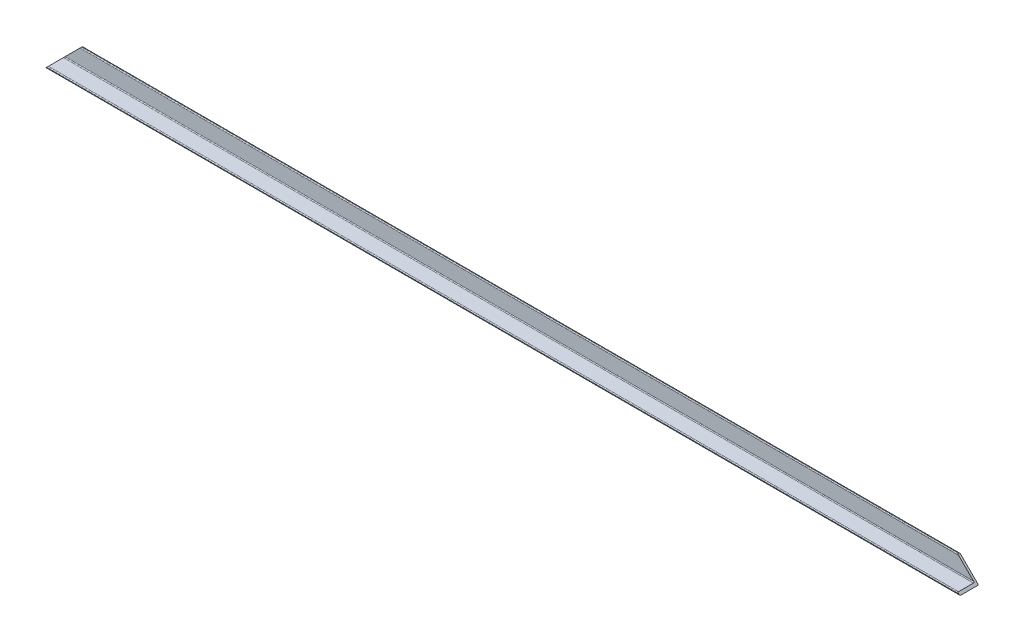
ISO-10303-21;
HEADER;
FILE_DESCRIPTION(('STEP AP214'),'2;1');
FILE_NAME('part.step','',(''),(''),'','','');
FILE_SCHEMA(('AUTOMOTIVE_DESIGN { 1 0 10303 214 1 1 1 1 }'));
ENDSEC;
DATA;
#1=APPLICATION_CONTEXT('core data for automotive mechanical design processes');
#2=APPLICATION_PROTOCOL_DEFINITION('international standard','automotive_design',2000,#1);
#3=PRODUCT_CONTEXT('',#1,'mechanical');
#4=PRODUCT('Part','Part','',(#3));
#5=PRODUCT_RELATED_PRODUCT_CATEGORY('part','',(#4));
#6=PRODUCT_DEFINITION_FORMATION('','',#4);
#7=PRODUCT_DEFINITION_CONTEXT('part definition',#1,'design');
#8=PRODUCT_DEFINITION('design','',#6,#7);
#9=PRODUCT_DEFINITION_SHAPE('','',#8);
#10=(LENGTH_UNIT() NAMED_UNIT(*) SI_UNIT(.MILLI.,.METRE.));
#11=(NAMED_UNIT(*) PLANE_ANGLE_UNIT() SI_UNIT($,.RADIAN.));
#12=(NAMED_UNIT(*) SI_UNIT($,.STERADIAN.) SOLID_ANGLE_UNIT());
#13=UNCERTAINTY_MEASURE_WITH_UNIT(LENGTH_MEASURE(1.E-05),#10,'distance_accuracy_value','');
#14=(GEOMETRIC_REPRESENTATION_CONTEXT(3) GLOBAL_UNCERTAINTY_ASSIGNED_CONTEXT((#13)) GLOBAL_UNIT_ASSIGNED_CONTEXT((#10,
#11,#12)) REPRESENTATION_CONTEXT('',''));
#15=CARTESIAN_POINT('',(0.,0.,0.));
#16=DIRECTION('',(0.,0.,1.));
#17=DIRECTION('',(1.,0.,0.));
#18=AXIS2_PLACEMENT_3D('',#15,#16,#17);
#19=CARTESIAN_POINT('',(-557.5,2.5,-11.25));
#20=DIRECTION('',(0.,0.,1.));
#21=DIRECTION('',(1.,0.,0.));
#22=AXIS2_PLACEMENT_3D('',#19,#20,#21);
#23=PLANE('',#22);
#24=DIRECTION('',(-0.707106781186543,0.707106781186553,0.));
#25=VECTOR('',#24,1.);
#26=CARTESIAN_POINT('',(-4.99999999999212,555.,-11.25));
#27=LINE('',#26,#25);
#28=CARTESIAN_POINT('',(549.,0.99999999999989,-11.25));
#29=VERTEX_POINT('',#28);
#30=CARTESIAN_POINT('',(528.500000000001,21.5,-11.25));
#31=VERTEX_POINT('',#30);
#32=EDGE_CURVE('E125',#29,#31,#27,.T.);
#33=ORIENTED_EDGE('',*,*,#32,.F.);
#34=DIRECTION('',(-1.,0.,0.));
#35=VECTOR('',#34,1.);
#36=CARTESIAN_POINT('',(-557.5,1.,-11.25));
#37=LINE('',#36,#35);
#38=CARTESIAN_POINT('',(-549.,1.00000000000002,-11.25));
#39=VERTEX_POINT('',#38);
#40=EDGE_CURVE('E137',#29,#39,#37,.T.);
#41=ORIENTED_EDGE('',*,*,#40,.T.);
#42=DIRECTION('',(-0.707106781186544,-0.707106781186551,0.));
#43=VECTOR('',#42,1.);
#44=CARTESIAN_POINT('',(-552.5,-2.49999999999995,-11.25));
#45=LINE('',#44,#43);
#46=CARTESIAN_POINT('',(-528.5,21.5,-11.25));
#47=VERTEX_POINT('',#46);
#48=EDGE_CURVE('E220',#47,#39,#45,.T.);
#49=ORIENTED_EDGE('',*,*,#48,.F.);
#50=DIRECTION('',(-1.,0.,0.));
#51=VECTOR('',#50,1.);
#52=CARTESIAN_POINT('',(527.5,21.5,-11.25));
#53=LINE('',#52,#51);
#54=EDGE_CURVE('E140',#47,#31,#53,.F.);
#55=ORIENTED_EDGE('',*,*,#54,.T.);
#56=EDGE_LOOP('',(#33,#41,#49,#55));
#57=FACE_BOUND('',#56,.T.);
#58=ADVANCED_FACE('F32',(#57),#23,.F.);
#59=CARTESIAN_POINT('',(-557.5,2.5,11.25));
#60=DIRECTION('',(0.,0.,-1.));
#61=DIRECTION('',(-1.,0.,0.));
#62=AXIS2_PLACEMENT_3D('',#59,#60,#61);
#63=PLANE('',#62);
#64=DIRECTION('',(0.707106781186544,0.707106781186551,0.));
#65=VECTOR('',#64,1.);
#66=CARTESIAN_POINT('',(-557.5,-7.5,11.25));
#67=LINE('',#66,#65);
#68=CARTESIAN_POINT('',(-549.,1.00000000000002,11.25));
#69=VERTEX_POINT('',#68);
#70=CARTESIAN_POINT('',(-548.5,1.49999999999999,11.25));
#71=VERTEX_POINT('',#70);
#72=EDGE_CURVE('E141',#69,#71,#67,.T.);
#73=ORIENTED_EDGE('',*,*,#72,.F.);
#74=DIRECTION('',(1.,0.,0.));
#75=VECTOR('',#74,1.);
#76=CARTESIAN_POINT('',(-557.5,1.,11.25));
#77=LINE('',#76,#75);
#78=CARTESIAN_POINT('',(549.,0.999999999999977,11.25));
#79=VERTEX_POINT('',#78);
#80=EDGE_CURVE('E170',#69,#79,#77,.T.);
#81=ORIENTED_EDGE('',*,*,#80,.T.);
#82=DIRECTION('',(0.707106781186542,-0.707106781186552,0.));
#83=VECTOR('',#82,1.);
#84=CARTESIAN_POINT('',(557.5,-7.5,11.25));
#85=LINE('',#84,#83);
#86=CARTESIAN_POINT('',(548.5,1.50000000000001,11.25));
#87=VERTEX_POINT('',#86);
#88=EDGE_CURVE('E233',#87,#79,#85,.T.);
#89=ORIENTED_EDGE('',*,*,#88,.F.);
#90=DIRECTION('',(1.,0.,0.));
#91=VECTOR('',#90,1.);
#92=CARTESIAN_POINT('',(-547.5,1.5,11.25));
#93=LINE('',#92,#91);
#94=EDGE_CURVE('E132',#87,#71,#93,.F.);
#95=ORIENTED_EDGE('',*,*,#94,.T.);
#96=EDGE_LOOP('',(#73,#81,#89,#95));
#97=FACE_BOUND('',#96,.T.);
#98=ADVANCED_FACE('F240',(#97),#63,.F.);
#99=CARTESIAN_POINT('',(0.,2.5,0.));
#100=DIRECTION('',(0.,1.,0.));
#101=DIRECTION('',(0.,0.,1.));
#102=AXIS2_PLACEMENT_3D('',#99,#100,#101);
#103=PLANE('',#102);
#104=DIRECTION('',(0.,0.,1.));
#105=VECTOR('',#104,1.);
#106=CARTESIAN_POINT('',(-547.5,2.5,0.));
#107=LINE('',#106,#105);
#108=CARTESIAN_POINT('',(-547.5,2.5,-7.75));
#109=VERTEX_POINT('',#108);
#110=CARTESIAN_POINT('',(-547.5,2.5,10.25));
#111=VERTEX_POINT('',#110);
#112=EDGE_CURVE('E208',#109,#111,#107,.T.);
#113=ORIENTED_EDGE('',*,*,#112,.T.);
#114=DIRECTION('',(1.,0.,0.));
#115=VECTOR('',#114,1.);
#116=CARTESIAN_POINT('',(547.5,2.5,10.25));
#117=LINE('',#116,#115);
#118=CARTESIAN_POINT('',(547.5,2.5,10.25));
#119=VERTEX_POINT('',#118);
#120=EDGE_CURVE('E174',#111,#119,#117,.T.);
#121=ORIENTED_EDGE('',*,*,#120,.T.);
#122=DIRECTION('',(0.,0.,-1.));
#123=VECTOR('',#122,1.);
#124=CARTESIAN_POINT('',(547.5,2.5,0.));
#125=LINE('',#124,#123);
#126=CARTESIAN_POINT('',(547.5,2.5,-7.75));
#127=VERTEX_POINT('',#126);
#128=EDGE_CURVE('E189',#119,#127,#125,.T.);
#129=ORIENTED_EDGE('',*,*,#128,.T.);
#130=DIRECTION('',(1.,0.,0.));
#131=VECTOR('',#130,1.);
#132=CARTESIAN_POINT('',(0.,2.5,-7.75));
#133=LINE('',#132,#131);
#134=EDGE_CURVE('E172',#127,#109,#133,.F.);
#135=ORIENTED_EDGE('',*,*,#134,.T.);
#136=EDGE_LOOP('',(#113,#121,#129,#135));
#137=FACE_BOUND('',#136,.T.);
#138=ADVANCED_FACE('F197',(#137),#103,.T.);
#139=CARTESIAN_POINT('',(0.,0.,0.));
#140=DIRECTION('',(0.,1.,0.));
#141=DIRECTION('',(0.,0.,1.));
#142=AXIS2_PLACEMENT_3D('',#139,#140,#141);
#143=PLANE('',#142);
#144=DIRECTION('',(0.,0.,1.));
#145=VECTOR('',#144,1.);
#146=CARTESIAN_POINT('',(-550.,0.,0.));
#147=LINE('',#146,#145);
#148=CARTESIAN_POINT('',(-550.,0.,-10.25));
#149=VERTEX_POINT('',#148);
#150=CARTESIAN_POINT('',(-550.,0.,10.25));
#151=VERTEX_POINT('',#150);
#152=EDGE_CURVE('E213',#149,#151,#147,.T.);
#153=ORIENTED_EDGE('',*,*,#152,.F.);
#154=DIRECTION('',(-1.,0.,0.));
#155=VECTOR('',#154,1.);
#156=CARTESIAN_POINT('',(0.,0.,-10.25));
#157=LINE('',#156,#155);
#158=CARTESIAN_POINT('',(550.,0.,-10.25));
#159=VERTEX_POINT('',#158);
#160=EDGE_CURVE('E161',#149,#159,#157,.F.);
#161=ORIENTED_EDGE('',*,*,#160,.T.);
#162=DIRECTION('',(0.,0.,-1.));
#163=VECTOR('',#162,1.);
#164=CARTESIAN_POINT('',(550.,0.,0.));
#165=LINE('',#164,#163);
#166=CARTESIAN_POINT('',(550.,0.,10.25));
#167=VERTEX_POINT('',#166);
#168=EDGE_CURVE('E128',#167,#159,#165,.T.);
#169=ORIENTED_EDGE('',*,*,#168,.F.);
#170=DIRECTION('',(1.,0.,0.));
#171=VECTOR('',#170,1.);
#172=CARTESIAN_POINT('',(0.,0.,10.25));
#173=LINE('',#172,#171);
#174=EDGE_CURVE('E159',#167,#151,#173,.F.);
#175=ORIENTED_EDGE('',*,*,#174,.T.);
#176=EDGE_LOOP('',(#153,#161,#169,#175));
#177=FACE_BOUND('',#176,.T.);
#178=ADVANCED_FACE('F248',(#177),#143,.F.);
#179=CARTESIAN_POINT('',(-557.5,22.5,-8.75));
#180=DIRECTION('',(0.,0.,-1.));
#181=DIRECTION('',(-1.,0.,0.));
#182=AXIS2_PLACEMENT_3D('',#179,#180,#181);
#183=PLANE('',#182);
#184=DIRECTION('',(0.707106781186543,-0.707106781186553,0.));
#185=VECTOR('',#184,1.);
#186=CARTESIAN_POINT('',(-14.9999999999921,565.,-8.75));
#187=LINE('',#186,#185);
#188=CARTESIAN_POINT('',(528.500000000001,21.5,-8.75));
#189=VERTEX_POINT('',#188);
#190=CARTESIAN_POINT('',(546.5,3.49999999999984,-8.75));
#191=VERTEX_POINT('',#190);
#192=EDGE_CURVE('E191',#189,#191,#187,.T.);
#193=ORIENTED_EDGE('',*,*,#192,.F.);
#194=DIRECTION('',(1.,0.,0.));
#195=VECTOR('',#194,1.);
#196=CARTESIAN_POINT('',(-527.5,21.5,-8.75));
#197=LINE('',#196,#195);
#198=CARTESIAN_POINT('',(-528.5,21.5,-8.75));
#199=VERTEX_POINT('',#198);
#200=EDGE_CURVE('E186',#189,#199,#197,.F.);
#201=ORIENTED_EDGE('',*,*,#200,.T.);
#202=DIRECTION('',(0.707106781186544,0.707106781186551,0.));
#203=VECTOR('',#202,1.);
#204=CARTESIAN_POINT('',(-542.5,7.50000000000015,-8.75));
#205=LINE('',#204,#203);
#206=CARTESIAN_POINT('',(-546.5,3.5,-8.75));
#207=VERTEX_POINT('',#206);
#208=EDGE_CURVE('E206',#207,#199,#205,.T.);
#209=ORIENTED_EDGE('',*,*,#208,.F.);
#210=DIRECTION('',(1.,0.,0.));
#211=VECTOR('',#210,1.);
#212=CARTESIAN_POINT('',(-557.5,3.5,-8.75));
#213=LINE('',#212,#211);
#214=EDGE_CURVE('E183',#207,#191,#213,.T.);
#215=ORIENTED_EDGE('',*,*,#214,.T.);
#216=EDGE_LOOP('',(#193,#201,#209,#215));
#217=FACE_BOUND('',#216,.T.);
#218=ADVANCED_FACE('F210',(#217),#183,.F.);
#219=CARTESIAN_POINT('',(0.,22.5,0.));
#220=DIRECTION('',(0.,1.,0.));
#221=DIRECTION('',(0.,0.,1.));
#222=AXIS2_PLACEMENT_3D('',#219,#220,#221);
#223=PLANE('',#222);
#224=DIRECTION('',(0.,0.,-1.));
#225=VECTOR('',#224,1.);
#226=CARTESIAN_POINT('',(527.5,22.5,11.25));
#227=LINE('',#226,#225);
#228=CARTESIAN_POINT('',(527.5,22.5,-9.75));
#229=VERTEX_POINT('',#228);
#230=CARTESIAN_POINT('',(527.5,22.5,-10.25));
#231=VERTEX_POINT('',#230);
#232=EDGE_CURVE('E231',#229,#231,#227,.T.);
#233=ORIENTED_EDGE('',*,*,#232,.T.);
#234=DIRECTION('',(-1.,0.,0.));
#235=VECTOR('',#234,1.);
#236=CARTESIAN_POINT('',(-527.5,22.5,-10.25));
#237=LINE('',#236,#235);
#238=CARTESIAN_POINT('',(-527.5,22.5,-10.25));
#239=VERTEX_POINT('',#238);
#240=EDGE_CURVE('E180',#231,#239,#237,.T.);
#241=ORIENTED_EDGE('',*,*,#240,.T.);
#242=DIRECTION('',(0.,0.,1.));
#243=VECTOR('',#242,1.);
#244=CARTESIAN_POINT('',(-527.5,22.5,0.));
#245=LINE('',#244,#243);
#246=CARTESIAN_POINT('',(-527.5,22.5,-9.75));
#247=VERTEX_POINT('',#246);
#248=EDGE_CURVE('E149',#239,#247,#245,.T.);
#249=ORIENTED_EDGE('',*,*,#248,.T.);
#250=DIRECTION('',(1.,0.,0.));
#251=VECTOR('',#250,1.);
#252=CARTESIAN_POINT('',(527.5,22.5,-9.75));
#253=LINE('',#252,#251);
#254=EDGE_CURVE('E177',#247,#229,#253,.T.);
#255=ORIENTED_EDGE('',*,*,#254,.T.);
#256=EDGE_LOOP('',(#233,#241,#249,#255));
#257=FACE_BOUND('',#256,.T.);
#258=ADVANCED_FACE('F226',(#257),#223,.T.);
#259=CARTESIAN_POINT('',(-557.5,-7.5,11.25));
#260=DIRECTION('',(-0.707106781186551,0.707106781186544,0.));
#261=DIRECTION('',(-0.707106781186544,-0.707106781186551,0.));
#262=AXIS2_PLACEMENT_3D('',#259,#260,#261);
#263=PLANE('',#262);
#264=ORIENTED_EDGE('',*,*,#48,.T.);
#265=CARTESIAN_POINT('',(-549.,1.,-10.25));
#266=DIRECTION('',(-0.707106781186551,0.707106781186544,0.));
#267=DIRECTION('',(-0.707106781186544,-0.707106781186551,0.));
#268=AXIS2_PLACEMENT_3D('',#265,#266,#267);
#269=ELLIPSE('',#268,1.41421356237309,1.);
#270=EDGE_CURVE('E144',#39,#149,#269,.T.);
#271=ORIENTED_EDGE('',*,*,#270,.T.);
#272=ORIENTED_EDGE('',*,*,#152,.T.);
#273=CARTESIAN_POINT('',(-549.,1.,10.25));
#274=DIRECTION('',(-0.707106781186551,0.707106781186544,0.));
#275=DIRECTION('',(0.707106781186544,0.707106781186551,0.));
#276=AXIS2_PLACEMENT_3D('',#273,#274,#275);
#277=ELLIPSE('',#276,1.41421356237309,1.);
#278=EDGE_CURVE('E156',#151,#69,#277,.T.);
#279=ORIENTED_EDGE('',*,*,#278,.T.);
#280=ORIENTED_EDGE('',*,*,#72,.T.);
#281=CARTESIAN_POINT('',(-548.5,1.5,10.25));
#282=DIRECTION('',(-0.707106781186551,0.707106781186544,0.));
#283=DIRECTION('',(-0.707106781186544,-0.707106781186551,0.));
#284=AXIS2_PLACEMENT_3D('',#281,#282,#283);
#285=ELLIPSE('',#284,1.41421356237309,1.);
#286=EDGE_CURVE('E154',#71,#111,#285,.T.);
#287=ORIENTED_EDGE('',*,*,#286,.T.);
#288=ORIENTED_EDGE('',*,*,#112,.F.);
#289=CARTESIAN_POINT('',(-546.5,3.5,-7.75));
#290=DIRECTION('',(-0.707106781186551,0.707106781186544,0.));
#291=DIRECTION('',(0.707106781186544,0.707106781186551,0.));
#292=AXIS2_PLACEMENT_3D('',#289,#290,#291);
#293=ELLIPSE('',#292,1.41421356237309,1.);
#294=EDGE_CURVE('E11',#109,#207,#293,.F.);
#295=ORIENTED_EDGE('',*,*,#294,.T.);
#296=ORIENTED_EDGE('',*,*,#208,.T.);
#297=CARTESIAN_POINT('',(-528.5,21.5,-9.75));
#298=DIRECTION('',(-0.707106781186551,0.707106781186544,0.));
#299=DIRECTION('',(-0.707106781186544,-0.707106781186551,0.));
#300=AXIS2_PLACEMENT_3D('',#297,#298,#299);
#301=ELLIPSE('',#300,1.41421356237309,1.);
#302=EDGE_CURVE('E145',#199,#247,#301,.T.);
#303=ORIENTED_EDGE('',*,*,#302,.T.);
#304=ORIENTED_EDGE('',*,*,#248,.F.);
#305=CARTESIAN_POINT('',(-528.5,21.5,-10.25));
#306=DIRECTION('',(-0.707106781186551,0.707106781186544,0.));
#307=DIRECTION('',(0.707106781186544,0.707106781186551,0.));
#308=AXIS2_PLACEMENT_3D('',#305,#306,#307);
#309=ELLIPSE('',#308,1.41421356237309,1.);
#310=EDGE_CURVE('E147',#239,#47,#309,.T.);
#311=ORIENTED_EDGE('',*,*,#310,.T.);
#312=EDGE_LOOP('',(#264,#271,#272,#279,#280,#287,#288,#295,#296,#303,#304,#311));
#313=FACE_BOUND('',#312,.T.);
#314=ADVANCED_FACE('F205',(#313),#263,.T.);
#315=CARTESIAN_POINT('',(557.5,-7.5,11.25));
#316=DIRECTION('',(0.707106781186553,0.707106781186543,0.));
#317=DIRECTION('',(-0.707106781186543,0.707106781186553,0.));
#318=AXIS2_PLACEMENT_3D('',#315,#316,#317);
#319=PLANE('',#318);
#320=ORIENTED_EDGE('',*,*,#168,.T.);
#321=CARTESIAN_POINT('',(549.,1.,-10.25));
#322=DIRECTION('',(0.707106781186553,0.707106781186543,0.));
#323=DIRECTION('',(-0.707106781186543,0.707106781186553,0.));
#324=AXIS2_PLACEMENT_3D('',#321,#322,#323);
#325=ELLIPSE('',#324,1.41421356237309,1.);
#326=EDGE_CURVE('E122',#159,#29,#325,.T.);
#327=ORIENTED_EDGE('',*,*,#326,.T.);
#328=ORIENTED_EDGE('',*,*,#32,.T.);
#329=CARTESIAN_POINT('',(528.5,21.5,-10.25));
#330=DIRECTION('',(0.707106781186553,0.707106781186543,0.));
#331=DIRECTION('',(0.707106781186543,-0.707106781186553,0.));
#332=AXIS2_PLACEMENT_3D('',#329,#330,#331);
#333=ELLIPSE('',#332,1.41421356237309,1.);
#334=EDGE_CURVE('E165',#31,#231,#333,.T.);
#335=ORIENTED_EDGE('',*,*,#334,.T.);
#336=ORIENTED_EDGE('',*,*,#232,.F.);
#337=CARTESIAN_POINT('',(528.5,21.5,-9.75));
#338=DIRECTION('',(0.707106781186553,0.707106781186543,0.));
#339=DIRECTION('',(-0.707106781186543,0.707106781186553,0.));
#340=AXIS2_PLACEMENT_3D('',#337,#338,#339);
#341=ELLIPSE('',#340,1.41421356237309,1.);
#342=EDGE_CURVE('E163',#229,#189,#341,.T.);
#343=ORIENTED_EDGE('',*,*,#342,.T.);
#344=ORIENTED_EDGE('',*,*,#192,.T.);
#345=CARTESIAN_POINT('',(546.5,3.5,-7.75));
#346=DIRECTION('',(0.707106781186553,0.707106781186543,0.));
#347=DIRECTION('',(0.707106781186543,-0.707106781186553,0.));
#348=AXIS2_PLACEMENT_3D('',#345,#346,#347);
#349=ELLIPSE('',#348,1.41421356237309,1.);
#350=EDGE_CURVE('E40',#191,#127,#349,.F.);
#351=ORIENTED_EDGE('',*,*,#350,.T.);
#352=ORIENTED_EDGE('',*,*,#128,.F.);
#353=CARTESIAN_POINT('',(548.5,1.5,10.25));
#354=DIRECTION('',(0.707106781186553,0.707106781186543,0.));
#355=DIRECTION('',(-0.707106781186543,0.707106781186553,0.));
#356=AXIS2_PLACEMENT_3D('',#353,#354,#355);
#357=ELLIPSE('',#356,1.41421356237309,1.);
#358=EDGE_CURVE('E55',#119,#87,#357,.T.);
#359=ORIENTED_EDGE('',*,*,#358,.T.);
#360=ORIENTED_EDGE('',*,*,#88,.T.);
#361=CARTESIAN_POINT('',(549.,1.,10.25));
#362=DIRECTION('',(0.707106781186553,0.707106781186543,0.));
#363=DIRECTION('',(0.707106781186543,-0.707106781186553,0.));
#364=AXIS2_PLACEMENT_3D('',#361,#362,#363);
#365=ELLIPSE('',#364,1.41421356237309,1.);
#366=EDGE_CURVE('E47',#79,#167,#365,.T.);
#367=ORIENTED_EDGE('',*,*,#366,.T.);
#368=EDGE_LOOP('',(#320,#327,#328,#335,#336,#343,#344,#351,#352,#359,#360,#367));
#369=FACE_BOUND('',#368,.T.);
#370=ADVANCED_FACE('F124',(#369),#319,.T.);
#371=CARTESIAN_POINT('',(-557.5,1.,-10.25));
#372=DIRECTION('',(-1.,0.,0.));
#373=DIRECTION('',(0.,0.,1.));
#374=AXIS2_PLACEMENT_3D('',#371,#372,#373);
#375=CYLINDRICAL_SURFACE('',#374,1.);
#376=ORIENTED_EDGE('',*,*,#326,.F.);
#377=ORIENTED_EDGE('',*,*,#160,.F.);
#378=ORIENTED_EDGE('',*,*,#270,.F.);
#379=ORIENTED_EDGE('',*,*,#40,.F.);
#380=EDGE_LOOP('',(#376,#377,#378,#379));
#381=FACE_BOUND('',#380,.T.);
#382=ADVANCED_FACE('F143',(#381),#375,.T.);
#383=CARTESIAN_POINT('',(-557.5,1.,10.25));
#384=DIRECTION('',(1.,0.,0.));
#385=DIRECTION('',(0.,0.,-1.));
#386=AXIS2_PLACEMENT_3D('',#383,#384,#385);
#387=CYLINDRICAL_SURFACE('',#386,1.);
#388=ORIENTED_EDGE('',*,*,#278,.F.);
#389=ORIENTED_EDGE('',*,*,#174,.F.);
#390=ORIENTED_EDGE('',*,*,#366,.F.);
#391=ORIENTED_EDGE('',*,*,#80,.F.);
#392=EDGE_LOOP('',(#388,#389,#390,#391));
#393=FACE_BOUND('',#392,.T.);
#394=ADVANCED_FACE('F245',(#393),#387,.T.);
#395=CARTESIAN_POINT('',(0.,1.5,10.25));
#396=DIRECTION('',(-1.,0.,0.));
#397=DIRECTION('',(0.,0.,1.));
#398=AXIS2_PLACEMENT_3D('',#395,#396,#397);
#399=CYLINDRICAL_SURFACE('',#398,1.);
#400=ORIENTED_EDGE('',*,*,#286,.F.);
#401=ORIENTED_EDGE('',*,*,#94,.F.);
#402=ORIENTED_EDGE('',*,*,#358,.F.);
#403=ORIENTED_EDGE('',*,*,#120,.F.);
#404=EDGE_LOOP('',(#400,#401,#402,#403));
#405=FACE_BOUND('',#404,.T.);
#406=ADVANCED_FACE('F243',(#405),#399,.T.);
#407=CARTESIAN_POINT('',(0.,21.5,-10.25));
#408=DIRECTION('',(1.,0.,0.));
#409=DIRECTION('',(0.,0.,-1.));
#410=AXIS2_PLACEMENT_3D('',#407,#408,#409);
#411=CYLINDRICAL_SURFACE('',#410,1.);
#412=ORIENTED_EDGE('',*,*,#334,.F.);
#413=ORIENTED_EDGE('',*,*,#54,.F.);
#414=ORIENTED_EDGE('',*,*,#310,.F.);
#415=ORIENTED_EDGE('',*,*,#240,.F.);
#416=EDGE_LOOP('',(#412,#413,#414,#415));
#417=FACE_BOUND('',#416,.T.);
#418=ADVANCED_FACE('F250',(#417),#411,.T.);
#419=CARTESIAN_POINT('',(0.,21.5,-9.75));
#420=DIRECTION('',(-1.,0.,0.));
#421=DIRECTION('',(0.,0.,1.));
#422=AXIS2_PLACEMENT_3D('',#419,#420,#421);
#423=CYLINDRICAL_SURFACE('',#422,1.);
#424=ORIENTED_EDGE('',*,*,#302,.F.);
#425=ORIENTED_EDGE('',*,*,#200,.F.);
#426=ORIENTED_EDGE('',*,*,#342,.F.);
#427=ORIENTED_EDGE('',*,*,#254,.F.);
#428=EDGE_LOOP('',(#424,#425,#426,#427));
#429=FACE_BOUND('',#428,.T.);
#430=ADVANCED_FACE('F230',(#429),#423,.T.);
#431=CARTESIAN_POINT('',(-557.5,3.5,-7.75));
#432=DIRECTION('',(1.,0.,0.));
#433=DIRECTION('',(0.,0.,-1.));
#434=AXIS2_PLACEMENT_3D('',#431,#432,#433);
#435=CYLINDRICAL_SURFACE('',#434,1.);
#436=ORIENTED_EDGE('',*,*,#294,.F.);
#437=ORIENTED_EDGE('',*,*,#134,.F.);
#438=ORIENTED_EDGE('',*,*,#350,.F.);
#439=ORIENTED_EDGE('',*,*,#214,.F.);
#440=EDGE_LOOP('',(#436,#437,#438,#439));
#441=FACE_BOUND('',#440,.T.);
#442=ADVANCED_FACE('F34',(#441),#435,.F.);
#443=CLOSED_SHELL('',(#58,#98,#138,#178,#218,#258,#314,#370,#382,#394,#406,#418,#430,#442));
#444=MANIFOLD_SOLID_BREP('B2',#443);
#445=ADVANCED_BREP_SHAPE_REPRESENTATION('',(#18,#444),#14);
#446=SHAPE_DEFINITION_REPRESENTATION(#9,#445);
ENDSEC;
END-ISO-10303-21;
